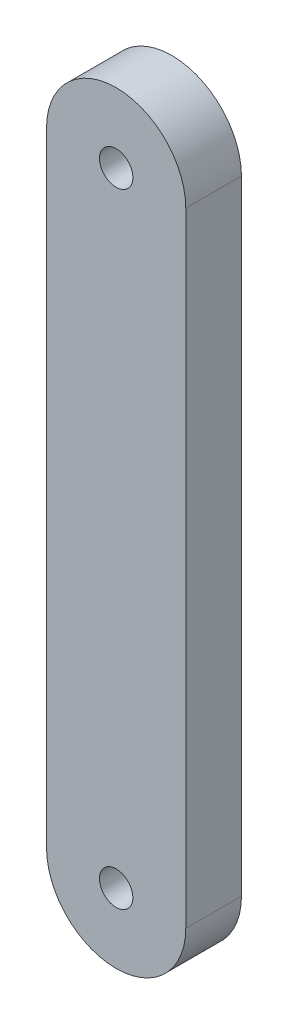
ISO-10303-21;
HEADER;
FILE_DESCRIPTION(('STEP AP214'),'2;1');
FILE_NAME('part.step','',(''),(''),'','','');
FILE_SCHEMA(('AUTOMOTIVE_DESIGN { 1 0 10303 214 1 1 1 1 }'));
ENDSEC;
DATA;
#1=APPLICATION_CONTEXT('core data for automotive mechanical design processes');
#2=APPLICATION_PROTOCOL_DEFINITION('international standard','automotive_design',2000,#1);
#3=PRODUCT_CONTEXT('',#1,'mechanical');
#4=PRODUCT('Part','Part','',(#3));
#5=PRODUCT_RELATED_PRODUCT_CATEGORY('part','',(#4));
#6=PRODUCT_DEFINITION_FORMATION('','',#4);
#7=PRODUCT_DEFINITION_CONTEXT('part definition',#1,'design');
#8=PRODUCT_DEFINITION('design','',#6,#7);
#9=PRODUCT_DEFINITION_SHAPE('','',#8);
#10=(LENGTH_UNIT() NAMED_UNIT(*) SI_UNIT(.MILLI.,.METRE.));
#11=(NAMED_UNIT(*) PLANE_ANGLE_UNIT() SI_UNIT($,.RADIAN.));
#12=(NAMED_UNIT(*) SI_UNIT($,.STERADIAN.) SOLID_ANGLE_UNIT());
#13=UNCERTAINTY_MEASURE_WITH_UNIT(LENGTH_MEASURE(1.E-05),#10,'distance_accuracy_value','');
#14=(GEOMETRIC_REPRESENTATION_CONTEXT(3) GLOBAL_UNCERTAINTY_ASSIGNED_CONTEXT((#13)) GLOBAL_UNIT_ASSIGNED_CONTEXT((#10,
#11,#12)) REPRESENTATION_CONTEXT('',''));
#15=CARTESIAN_POINT('',(0.,0.,0.));
#16=DIRECTION('',(0.,0.,1.));
#17=DIRECTION('',(1.,0.,0.));
#18=AXIS2_PLACEMENT_3D('',#15,#16,#17);
#19=CARTESIAN_POINT('',(0.,0.,10.));
#20=DIRECTION('',(0.,0.,1.));
#21=DIRECTION('',(1.,0.,0.));
#22=AXIS2_PLACEMENT_3D('',#19,#20,#21);
#23=PLANE('',#22);
#24=CARTESIAN_POINT('',(0.,0.,10.));
#25=DIRECTION('',(0.,0.,1.));
#26=DIRECTION('',(1.,0.,0.));
#27=AXIS2_PLACEMENT_3D('',#24,#25,#26);
#28=CIRCLE('',#27,3.);
#29=CARTESIAN_POINT('',(3.,0.,10.));
#30=VERTEX_POINT('',#29);
#31=EDGE_CURVE('E99',#30,#30,#28,.T.);
#32=ORIENTED_EDGE('',*,*,#31,.F.);
#33=EDGE_LOOP('',(#32));
#34=FACE_BOUND('',#33,.T.);
#35=CARTESIAN_POINT('',(0.,0.,10.));
#36=DIRECTION('',(0.,0.,1.));
#37=DIRECTION('',(1.,0.,0.));
#38=AXIS2_PLACEMENT_3D('',#35,#36,#37);
#39=CIRCLE('',#38,12.5);
#40=CARTESIAN_POINT('',(12.5,0.,10.));
#41=VERTEX_POINT('',#40);
#42=CARTESIAN_POINT('',(-12.5,0.,10.));
#43=VERTEX_POINT('',#42);
#44=EDGE_CURVE('E84',#41,#43,#39,.T.);
#45=ORIENTED_EDGE('',*,*,#44,.T.);
#46=DIRECTION('',(0.,-1.,0.));
#47=VECTOR('',#46,1.);
#48=CARTESIAN_POINT('',(-12.5,0.,10.));
#49=LINE('',#48,#47);
#50=CARTESIAN_POINT('',(-12.5,-112.,10.));
#51=VERTEX_POINT('',#50);
#52=EDGE_CURVE('E79',#43,#51,#49,.T.);
#53=ORIENTED_EDGE('',*,*,#52,.T.);
#54=CARTESIAN_POINT('',(0.,-112.,10.));
#55=DIRECTION('',(0.,0.,1.));
#56=DIRECTION('',(-1.,0.,0.));
#57=AXIS2_PLACEMENT_3D('',#54,#55,#56);
#58=CIRCLE('',#57,12.5);
#59=CARTESIAN_POINT('',(12.5,-112.,10.));
#60=VERTEX_POINT('',#59);
#61=EDGE_CURVE('E82',#51,#60,#58,.T.);
#62=ORIENTED_EDGE('',*,*,#61,.T.);
#63=DIRECTION('',(0.,1.,0.));
#64=VECTOR('',#63,1.);
#65=CARTESIAN_POINT('',(12.5,0.,10.));
#66=LINE('',#65,#64);
#67=EDGE_CURVE('E49',#60,#41,#66,.T.);
#68=ORIENTED_EDGE('',*,*,#67,.T.);
#69=EDGE_LOOP('',(#45,#53,#62,#68));
#70=FACE_BOUND('',#69,.T.);
#71=CARTESIAN_POINT('',(0.,-112.,10.));
#72=DIRECTION('',(0.,0.,1.));
#73=DIRECTION('',(-1.,0.,0.));
#74=AXIS2_PLACEMENT_3D('',#71,#72,#73);
#75=CIRCLE('',#74,3.);
#76=CARTESIAN_POINT('',(-3.,-112.,10.));
#77=VERTEX_POINT('',#76);
#78=EDGE_CURVE('E114',#77,#77,#75,.T.);
#79=ORIENTED_EDGE('',*,*,#78,.F.);
#80=EDGE_LOOP('',(#79));
#81=FACE_BOUND('',#80,.T.);
#82=ADVANCED_FACE('F32',(#34,#70,#81),#23,.T.);
#83=CARTESIAN_POINT('',(0.,0.,0.));
#84=DIRECTION('',(0.,0.,1.));
#85=DIRECTION('',(1.,0.,0.));
#86=AXIS2_PLACEMENT_3D('',#83,#84,#85);
#87=PLANE('',#86);
#88=CARTESIAN_POINT('',(0.,0.,0.));
#89=DIRECTION('',(0.,0.,1.));
#90=DIRECTION('',(1.,0.,0.));
#91=AXIS2_PLACEMENT_3D('',#88,#89,#90);
#92=CIRCLE('',#91,12.5);
#93=CARTESIAN_POINT('',(12.5,0.,0.));
#94=VERTEX_POINT('',#93);
#95=CARTESIAN_POINT('',(-12.5,0.,0.));
#96=VERTEX_POINT('',#95);
#97=EDGE_CURVE('E96',#94,#96,#92,.T.);
#98=ORIENTED_EDGE('',*,*,#97,.F.);
#99=DIRECTION('',(0.,1.,0.));
#100=VECTOR('',#99,1.);
#101=CARTESIAN_POINT('',(12.5,0.,0.));
#102=LINE('',#101,#100);
#103=CARTESIAN_POINT('',(12.5,-112.,0.));
#104=VERTEX_POINT('',#103);
#105=EDGE_CURVE('E72',#104,#94,#102,.T.);
#106=ORIENTED_EDGE('',*,*,#105,.F.);
#107=CARTESIAN_POINT('',(0.,-112.,0.));
#108=DIRECTION('',(0.,0.,1.));
#109=DIRECTION('',(-1.,0.,0.));
#110=AXIS2_PLACEMENT_3D('',#107,#108,#109);
#111=CIRCLE('',#110,12.5);
#112=CARTESIAN_POINT('',(-12.5,-112.,0.));
#113=VERTEX_POINT('',#112);
#114=EDGE_CURVE('E66',#113,#104,#111,.T.);
#115=ORIENTED_EDGE('',*,*,#114,.F.);
#116=DIRECTION('',(0.,-1.,0.));
#117=VECTOR('',#116,1.);
#118=CARTESIAN_POINT('',(-12.5,0.,0.));
#119=LINE('',#118,#117);
#120=EDGE_CURVE('E88',#96,#113,#119,.T.);
#121=ORIENTED_EDGE('',*,*,#120,.F.);
#122=EDGE_LOOP('',(#98,#106,#115,#121));
#123=FACE_BOUND('',#122,.T.);
#124=CARTESIAN_POINT('',(0.,0.,0.));
#125=DIRECTION('',(0.,0.,1.));
#126=DIRECTION('',(1.,0.,0.));
#127=AXIS2_PLACEMENT_3D('',#124,#125,#126);
#128=CIRCLE('',#127,3.);
#129=CARTESIAN_POINT('',(3.,0.,0.));
#130=VERTEX_POINT('',#129);
#131=EDGE_CURVE('E111',#130,#130,#128,.T.);
#132=ORIENTED_EDGE('',*,*,#131,.T.);
#133=EDGE_LOOP('',(#132));
#134=FACE_BOUND('',#133,.T.);
#135=CARTESIAN_POINT('',(0.,-112.,0.));
#136=DIRECTION('',(0.,0.,1.));
#137=DIRECTION('',(-1.,0.,0.));
#138=AXIS2_PLACEMENT_3D('',#135,#136,#137);
#139=CIRCLE('',#138,3.);
#140=CARTESIAN_POINT('',(-3.,-112.,0.));
#141=VERTEX_POINT('',#140);
#142=EDGE_CURVE('E117',#141,#141,#139,.T.);
#143=ORIENTED_EDGE('',*,*,#142,.T.);
#144=EDGE_LOOP('',(#143));
#145=FACE_BOUND('',#144,.T.);
#146=ADVANCED_FACE('F107',(#123,#134,#145),#87,.F.);
#147=CARTESIAN_POINT('',(0.,0.,10.));
#148=DIRECTION('',(0.,0.,-1.));
#149=DIRECTION('',(-1.,0.,0.));
#150=AXIS2_PLACEMENT_3D('',#147,#148,#149);
#151=CYLINDRICAL_SURFACE('',#150,12.5);
#152=ORIENTED_EDGE('',*,*,#97,.T.);
#153=DIRECTION('',(0.,0.,-1.));
#154=VECTOR('',#153,1.);
#155=CARTESIAN_POINT('',(-12.5,0.,10.));
#156=LINE('',#155,#154);
#157=EDGE_CURVE('E11',#43,#96,#156,.T.);
#158=ORIENTED_EDGE('',*,*,#157,.F.);
#159=ORIENTED_EDGE('',*,*,#44,.F.);
#160=DIRECTION('',(0.,0.,-1.));
#161=VECTOR('',#160,1.);
#162=CARTESIAN_POINT('',(12.5,0.,10.));
#163=LINE('',#162,#161);
#164=EDGE_CURVE('E92',#41,#94,#163,.T.);
#165=ORIENTED_EDGE('',*,*,#164,.T.);
#166=EDGE_LOOP('',(#152,#158,#159,#165));
#167=FACE_BOUND('',#166,.T.);
#168=ADVANCED_FACE('F34',(#167),#151,.T.);
#169=CARTESIAN_POINT('',(-12.5,0.,10.));
#170=DIRECTION('',(1.,0.,0.));
#171=DIRECTION('',(0.,1.,0.));
#172=AXIS2_PLACEMENT_3D('',#169,#170,#171);
#173=PLANE('',#172);
#174=ORIENTED_EDGE('',*,*,#120,.T.);
#175=DIRECTION('',(0.,0.,-1.));
#176=VECTOR('',#175,1.);
#177=CARTESIAN_POINT('',(-12.5,-112.,10.));
#178=LINE('',#177,#176);
#179=EDGE_CURVE('E41',#51,#113,#178,.T.);
#180=ORIENTED_EDGE('',*,*,#179,.F.);
#181=ORIENTED_EDGE('',*,*,#52,.F.);
#182=ORIENTED_EDGE('',*,*,#157,.T.);
#183=EDGE_LOOP('',(#174,#180,#181,#182));
#184=FACE_BOUND('',#183,.T.);
#185=ADVANCED_FACE('F87',(#184),#173,.F.);
#186=CARTESIAN_POINT('',(0.,-112.,10.));
#187=DIRECTION('',(0.,0.,-1.));
#188=DIRECTION('',(-1.,0.,0.));
#189=AXIS2_PLACEMENT_3D('',#186,#187,#188);
#190=CYLINDRICAL_SURFACE('',#189,12.5);
#191=ORIENTED_EDGE('',*,*,#114,.T.);
#192=DIRECTION('',(0.,0.,-1.));
#193=VECTOR('',#192,1.);
#194=CARTESIAN_POINT('',(12.5,-112.,10.));
#195=LINE('',#194,#193);
#196=EDGE_CURVE('E89',#60,#104,#195,.T.);
#197=ORIENTED_EDGE('',*,*,#196,.F.);
#198=ORIENTED_EDGE('',*,*,#61,.F.);
#199=ORIENTED_EDGE('',*,*,#179,.T.);
#200=EDGE_LOOP('',(#191,#197,#198,#199));
#201=FACE_BOUND('',#200,.T.);
#202=ADVANCED_FACE('F90',(#201),#190,.T.);
#203=CARTESIAN_POINT('',(12.5,0.,10.));
#204=DIRECTION('',(-1.,0.,0.));
#205=DIRECTION('',(0.,-1.,0.));
#206=AXIS2_PLACEMENT_3D('',#203,#204,#205);
#207=PLANE('',#206);
#208=ORIENTED_EDGE('',*,*,#105,.T.);
#209=ORIENTED_EDGE('',*,*,#164,.F.);
#210=ORIENTED_EDGE('',*,*,#67,.F.);
#211=ORIENTED_EDGE('',*,*,#196,.T.);
#212=EDGE_LOOP('',(#208,#209,#210,#211));
#213=FACE_BOUND('',#212,.T.);
#214=ADVANCED_FACE('F104',(#213),#207,.F.);
#215=CARTESIAN_POINT('',(0.,0.,10.));
#216=DIRECTION('',(0.,0.,-1.));
#217=DIRECTION('',(-1.,0.,0.));
#218=AXIS2_PLACEMENT_3D('',#215,#216,#217);
#219=CYLINDRICAL_SURFACE('',#218,3.);
#220=ORIENTED_EDGE('',*,*,#31,.T.);
#221=EDGE_LOOP('',(#220));
#222=FACE_BOUND('',#221,.T.);
#223=ORIENTED_EDGE('',*,*,#131,.F.);
#224=EDGE_LOOP('',(#223));
#225=FACE_BOUND('',#224,.T.);
#226=ADVANCED_FACE('F134',(#222,#225),#219,.F.);
#227=CARTESIAN_POINT('',(0.,-112.,10.));
#228=DIRECTION('',(0.,0.,-1.));
#229=DIRECTION('',(-1.,0.,0.));
#230=AXIS2_PLACEMENT_3D('',#227,#228,#229);
#231=CYLINDRICAL_SURFACE('',#230,3.);
#232=ORIENTED_EDGE('',*,*,#78,.T.);
#233=EDGE_LOOP('',(#232));
#234=FACE_BOUND('',#233,.T.);
#235=ORIENTED_EDGE('',*,*,#142,.F.);
#236=EDGE_LOOP('',(#235));
#237=FACE_BOUND('',#236,.T.);
#238=ADVANCED_FACE('F123',(#234,#237),#231,.F.);
#239=CLOSED_SHELL('',(#82,#146,#168,#185,#202,#214,#226,#238));
#240=MANIFOLD_SOLID_BREP('B2',#239);
#241=ADVANCED_BREP_SHAPE_REPRESENTATION('',(#18,#240),#14);
#242=SHAPE_DEFINITION_REPRESENTATION(#9,#241);
ENDSEC;
END-ISO-10303-21;
